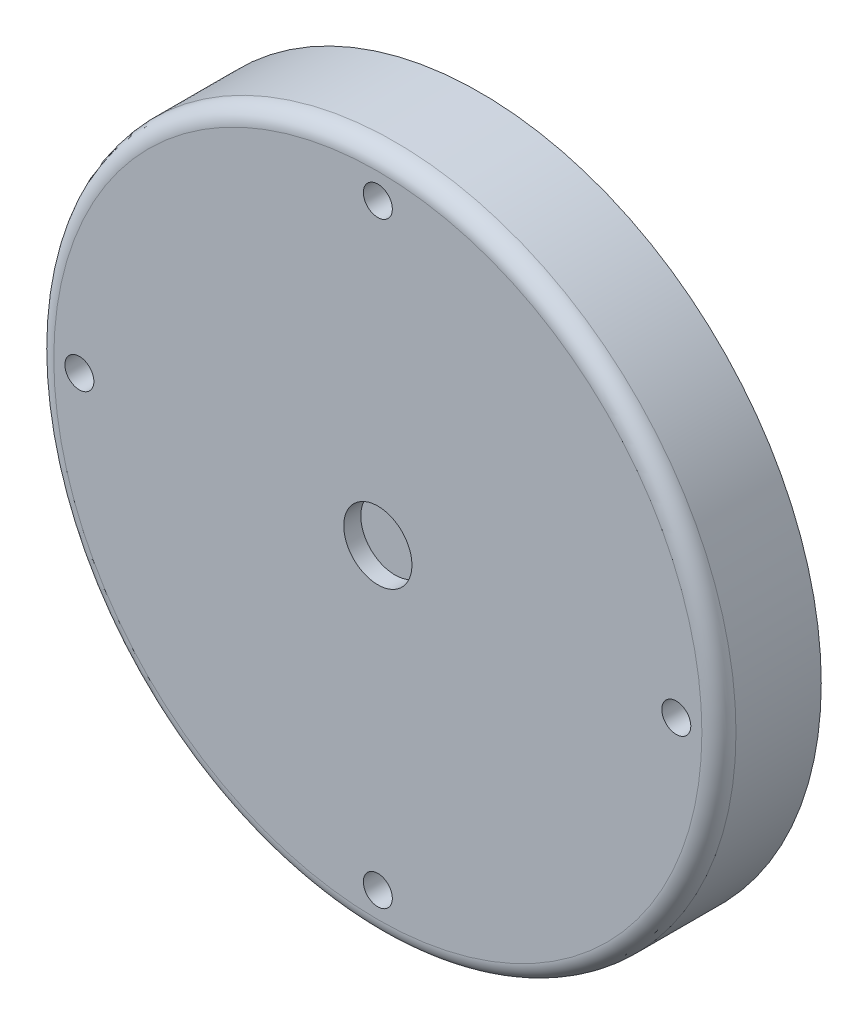
ISO-10303-21;
HEADER;
FILE_DESCRIPTION(('STEP AP214'),'2;1');
FILE_NAME('part.step','',(''),(''),'','','');
FILE_SCHEMA(('AUTOMOTIVE_DESIGN { 1 0 10303 214 1 1 1 1 }'));
ENDSEC;
DATA;
#1=APPLICATION_CONTEXT('core data for automotive mechanical design processes');
#2=APPLICATION_PROTOCOL_DEFINITION('international standard','automotive_design',2000,#1);
#3=PRODUCT_CONTEXT('',#1,'mechanical');
#4=PRODUCT('Part','Part','',(#3));
#5=PRODUCT_RELATED_PRODUCT_CATEGORY('part','',(#4));
#6=PRODUCT_DEFINITION_FORMATION('','',#4);
#7=PRODUCT_DEFINITION_CONTEXT('part definition',#1,'design');
#8=PRODUCT_DEFINITION('design','',#6,#7);
#9=PRODUCT_DEFINITION_SHAPE('','',#8);
#10=(LENGTH_UNIT() NAMED_UNIT(*) SI_UNIT(.MILLI.,.METRE.));
#11=(NAMED_UNIT(*) PLANE_ANGLE_UNIT() SI_UNIT($,.RADIAN.));
#12=(NAMED_UNIT(*) SI_UNIT($,.STERADIAN.) SOLID_ANGLE_UNIT());
#13=UNCERTAINTY_MEASURE_WITH_UNIT(LENGTH_MEASURE(1.E-05),#10,'distance_accuracy_value','');
#14=(GEOMETRIC_REPRESENTATION_CONTEXT(3) GLOBAL_UNCERTAINTY_ASSIGNED_CONTEXT((#13)) GLOBAL_UNIT_ASSIGNED_CONTEXT((#10,
#11,#12)) REPRESENTATION_CONTEXT('',''));
#15=CARTESIAN_POINT('',(0.,0.,0.));
#16=DIRECTION('',(0.,0.,1.));
#17=DIRECTION('',(1.,0.,0.));
#18=AXIS2_PLACEMENT_3D('',#15,#16,#17);
#19=CARTESIAN_POINT('',(0.,0.,-25.));
#20=DIRECTION('',(0.,0.,1.));
#21=DIRECTION('',(1.,0.,0.));
#22=AXIS2_PLACEMENT_3D('',#19,#20,#21);
#23=CYLINDRICAL_SURFACE('',#22,75.);
#24=CARTESIAN_POINT('',(0.,0.,-16.));
#25=DIRECTION('',(0.,0.,1.));
#26=DIRECTION('',(1.,0.,0.));
#27=AXIS2_PLACEMENT_3D('',#24,#25,#26);
#28=CIRCLE('',#27,75.);
#29=CARTESIAN_POINT('',(75.,0.,-16.));
#30=VERTEX_POINT('',#29);
#31=EDGE_CURVE('E108',#30,#30,#28,.T.);
#32=ORIENTED_EDGE('',*,*,#31,.T.);
#33=EDGE_LOOP('',(#32));
#34=FACE_BOUND('',#33,.T.);
#35=CARTESIAN_POINT('',(0.,0.,-25.));
#36=DIRECTION('',(0.,0.,-1.));
#37=DIRECTION('',(-1.,0.,0.));
#38=AXIS2_PLACEMENT_3D('',#35,#36,#37);
#39=CIRCLE('',#38,75.);
#40=CARTESIAN_POINT('',(-75.,0.,-25.));
#41=VERTEX_POINT('',#40);
#42=EDGE_CURVE('E69',#41,#41,#39,.T.);
#43=ORIENTED_EDGE('',*,*,#42,.T.);
#44=EDGE_LOOP('',(#43));
#45=FACE_BOUND('',#44,.T.);
#46=ADVANCED_FACE('F50',(#34,#45),#23,.F.);
#47=CARTESIAN_POINT('',(0.,0.,5.));
#48=DIRECTION('',(0.,0.,-1.));
#49=DIRECTION('',(-1.,0.,0.));
#50=AXIS2_PLACEMENT_3D('',#47,#48,#49);
#51=CYLINDRICAL_SURFACE('',#50,100.);
#52=CARTESIAN_POINT('',(0.,0.,0.));
#53=DIRECTION('',(0.,0.,1.));
#54=DIRECTION('',(1.,0.,0.));
#55=AXIS2_PLACEMENT_3D('',#52,#53,#54);
#56=CIRCLE('',#55,100.);
#57=CARTESIAN_POINT('',(100.,0.,0.));
#58=VERTEX_POINT('',#57);
#59=EDGE_CURVE('E11',#58,#58,#56,.F.);
#60=ORIENTED_EDGE('',*,*,#59,.T.);
#61=EDGE_LOOP('',(#60));
#62=FACE_BOUND('',#61,.T.);
#63=CARTESIAN_POINT('',(0.,0.,-25.));
#64=DIRECTION('',(0.,0.,-1.));
#65=DIRECTION('',(-1.,0.,0.));
#66=AXIS2_PLACEMENT_3D('',#63,#64,#65);
#67=CIRCLE('',#66,100.);
#68=CARTESIAN_POINT('',(-100.,0.,-25.));
#69=VERTEX_POINT('',#68);
#70=EDGE_CURVE('E64',#69,#69,#67,.T.);
#71=ORIENTED_EDGE('',*,*,#70,.F.);
#72=EDGE_LOOP('',(#71));
#73=FACE_BOUND('',#72,.T.);
#74=ADVANCED_FACE('F204',(#62,#73),#51,.T.);
#75=CARTESIAN_POINT('',(0.,0.,5.));
#76=DIRECTION('',(0.,0.,1.));
#77=DIRECTION('',(1.,0.,0.));
#78=AXIS2_PLACEMENT_3D('',#75,#76,#77);
#79=PLANE('',#78);
#80=CARTESIAN_POINT('',(0.,87.5,5.));
#81=DIRECTION('',(0.,0.,1.));
#82=DIRECTION('',(1.,0.,0.));
#83=AXIS2_PLACEMENT_3D('',#80,#81,#82);
#84=CIRCLE('',#83,4.25);
#85=CARTESIAN_POINT('',(4.25,87.5,5.));
#86=VERTEX_POINT('',#85);
#87=EDGE_CURVE('E83',#86,#86,#84,.T.);
#88=ORIENTED_EDGE('',*,*,#87,.F.);
#89=EDGE_LOOP('',(#88));
#90=FACE_BOUND('',#89,.T.);
#91=CARTESIAN_POINT('',(87.5,0.,5.));
#92=DIRECTION('',(0.,0.,1.));
#93=DIRECTION('',(1.,0.,0.));
#94=AXIS2_PLACEMENT_3D('',#91,#92,#93);
#95=CIRCLE('',#94,4.25000000000001);
#96=CARTESIAN_POINT('',(91.75,0.,5.));
#97=VERTEX_POINT('',#96);
#98=EDGE_CURVE('E90',#97,#97,#95,.T.);
#99=ORIENTED_EDGE('',*,*,#98,.F.);
#100=EDGE_LOOP('',(#99));
#101=FACE_BOUND('',#100,.T.);
#102=CARTESIAN_POINT('',(0.,-87.5,5.));
#103=DIRECTION('',(0.,0.,1.));
#104=DIRECTION('',(1.,0.,0.));
#105=AXIS2_PLACEMENT_3D('',#102,#103,#104);
#106=CIRCLE('',#105,4.25);
#107=CARTESIAN_POINT('',(4.25,-87.5,5.));
#108=VERTEX_POINT('',#107);
#109=EDGE_CURVE('E94',#108,#108,#106,.T.);
#110=ORIENTED_EDGE('',*,*,#109,.F.);
#111=EDGE_LOOP('',(#110));
#112=FACE_BOUND('',#111,.T.);
#113=CARTESIAN_POINT('',(-87.5,0.,5.));
#114=DIRECTION('',(0.,0.,1.));
#115=DIRECTION('',(1.,0.,0.));
#116=AXIS2_PLACEMENT_3D('',#113,#114,#115);
#117=CIRCLE('',#116,4.25000000000001);
#118=CARTESIAN_POINT('',(-83.25,0.,5.));
#119=VERTEX_POINT('',#118);
#120=EDGE_CURVE('E98',#119,#119,#117,.T.);
#121=ORIENTED_EDGE('',*,*,#120,.F.);
#122=EDGE_LOOP('',(#121));
#123=FACE_BOUND('',#122,.T.);
#124=CARTESIAN_POINT('',(0.,0.,5.));
#125=DIRECTION('',(0.,0.,1.));
#126=DIRECTION('',(1.,0.,0.));
#127=AXIS2_PLACEMENT_3D('',#124,#125,#126);
#128=CIRCLE('',#127,10.);
#129=CARTESIAN_POINT('',(10.,0.,5.));
#130=VERTEX_POINT('',#129);
#131=EDGE_CURVE('E79',#130,#130,#128,.T.);
#132=ORIENTED_EDGE('',*,*,#131,.F.);
#133=EDGE_LOOP('',(#132));
#134=FACE_BOUND('',#133,.T.);
#135=CARTESIAN_POINT('',(0.,0.,5.));
#136=DIRECTION('',(0.,0.,1.));
#137=DIRECTION('',(1.,0.,0.));
#138=AXIS2_PLACEMENT_3D('',#135,#136,#137);
#139=CIRCLE('',#138,95.);
#140=CARTESIAN_POINT('',(95.,0.,5.));
#141=VERTEX_POINT('',#140);
#142=EDGE_CURVE('E58',#141,#141,#139,.T.);
#143=ORIENTED_EDGE('',*,*,#142,.T.);
#144=EDGE_LOOP('',(#143));
#145=FACE_BOUND('',#144,.T.);
#146=ADVANCED_FACE('F209',(#90,#101,#112,#123,#134,#145),#79,.T.);
#147=CARTESIAN_POINT('',(0.,0.,-25.));
#148=DIRECTION('',(0.,0.,-1.));
#149=DIRECTION('',(-1.,0.,0.));
#150=AXIS2_PLACEMENT_3D('',#147,#148,#149);
#151=PLANE('',#150);
#152=CARTESIAN_POINT('',(0.,87.5,-25.));
#153=DIRECTION('',(0.,0.,1.));
#154=DIRECTION('',(1.,0.,0.));
#155=AXIS2_PLACEMENT_3D('',#152,#153,#154);
#156=CIRCLE('',#155,4.25);
#157=CARTESIAN_POINT('',(4.25,87.5,-25.));
#158=VERTEX_POINT('',#157);
#159=EDGE_CURVE('E102',#158,#158,#156,.T.);
#160=ORIENTED_EDGE('',*,*,#159,.T.);
#161=EDGE_LOOP('',(#160));
#162=FACE_BOUND('',#161,.T.);
#163=CARTESIAN_POINT('',(87.5,0.,-25.));
#164=DIRECTION('',(0.,0.,1.));
#165=DIRECTION('',(1.,0.,0.));
#166=AXIS2_PLACEMENT_3D('',#163,#164,#165);
#167=CIRCLE('',#166,4.25000000000001);
#168=CARTESIAN_POINT('',(91.75,0.,-25.));
#169=VERTEX_POINT('',#168);
#170=EDGE_CURVE('E112',#169,#169,#167,.T.);
#171=ORIENTED_EDGE('',*,*,#170,.T.);
#172=EDGE_LOOP('',(#171));
#173=FACE_BOUND('',#172,.T.);
#174=CARTESIAN_POINT('',(0.,-87.5,-25.));
#175=DIRECTION('',(0.,0.,1.));
#176=DIRECTION('',(1.,0.,0.));
#177=AXIS2_PLACEMENT_3D('',#174,#175,#176);
#178=CIRCLE('',#177,4.25);
#179=CARTESIAN_POINT('',(4.25,-87.5,-25.));
#180=VERTEX_POINT('',#179);
#181=EDGE_CURVE('E107',#180,#180,#178,.T.);
#182=ORIENTED_EDGE('',*,*,#181,.T.);
#183=EDGE_LOOP('',(#182));
#184=FACE_BOUND('',#183,.T.);
#185=CARTESIAN_POINT('',(-87.5,0.,-25.));
#186=DIRECTION('',(0.,0.,1.));
#187=DIRECTION('',(1.,0.,0.));
#188=AXIS2_PLACEMENT_3D('',#185,#186,#187);
#189=CIRCLE('',#188,4.25000000000001);
#190=CARTESIAN_POINT('',(-83.25,0.,-25.));
#191=VERTEX_POINT('',#190);
#192=EDGE_CURVE('E103',#191,#191,#189,.T.);
#193=ORIENTED_EDGE('',*,*,#192,.T.);
#194=EDGE_LOOP('',(#193));
#195=FACE_BOUND('',#194,.T.);
#196=ORIENTED_EDGE('',*,*,#70,.T.);
#197=EDGE_LOOP('',(#196));
#198=FACE_BOUND('',#197,.T.);
#199=ORIENTED_EDGE('',*,*,#42,.F.);
#200=EDGE_LOOP('',(#199));
#201=FACE_BOUND('',#200,.T.);
#202=ADVANCED_FACE('F214',(#162,#173,#184,#195,#198,#201),#151,.T.);
#203=CARTESIAN_POINT('',(0.,0.,0.));
#204=DIRECTION('',(0.,0.,1.));
#205=DIRECTION('',(1.,0.,0.));
#206=AXIS2_PLACEMENT_3D('',#203,#204,#205);
#207=TOROIDAL_SURFACE('',#206,95.,5.);
#208=ORIENTED_EDGE('',*,*,#59,.F.);
#209=EDGE_LOOP('',(#208));
#210=FACE_BOUND('',#209,.T.);
#211=ORIENTED_EDGE('',*,*,#142,.F.);
#212=EDGE_LOOP('',(#211));
#213=FACE_BOUND('',#212,.T.);
#214=ADVANCED_FACE('F52',(#210,#213),#207,.T.);
#215=CARTESIAN_POINT('',(0.,0.,0.));
#216=DIRECTION('',(0.,0.,1.));
#217=DIRECTION('',(1.,0.,0.));
#218=AXIS2_PLACEMENT_3D('',#215,#216,#217);
#219=CYLINDRICAL_SURFACE('',#218,10.);
#220=CARTESIAN_POINT('',(0.,0.,0.));
#221=DIRECTION('',(0.,0.,1.));
#222=DIRECTION('',(1.,0.,0.));
#223=AXIS2_PLACEMENT_3D('',#220,#221,#222);
#224=CIRCLE('',#223,10.);
#225=CARTESIAN_POINT('',(10.,0.,0.));
#226=VERTEX_POINT('',#225);
#227=EDGE_CURVE('E75',#226,#226,#224,.T.);
#228=ORIENTED_EDGE('',*,*,#227,.F.);
#229=EDGE_LOOP('',(#228));
#230=FACE_BOUND('',#229,.T.);
#231=ORIENTED_EDGE('',*,*,#131,.T.);
#232=EDGE_LOOP('',(#231));
#233=FACE_BOUND('',#232,.T.);
#234=ADVANCED_FACE('F221',(#230,#233),#219,.F.);
#235=CARTESIAN_POINT('',(0.,0.,0.));
#236=DIRECTION('',(0.,0.,1.));
#237=DIRECTION('',(1.,0.,0.));
#238=AXIS2_PLACEMENT_3D('',#235,#236,#237);
#239=PLANE('',#238);
#240=ORIENTED_EDGE('',*,*,#227,.T.);
#241=EDGE_LOOP('',(#240));
#242=FACE_BOUND('',#241,.T.);
#243=ADVANCED_FACE('F239',(#242),#239,.T.);
#244=CARTESIAN_POINT('',(-87.5,0.,-25.));
#245=DIRECTION('',(0.,0.,1.));
#246=DIRECTION('',(1.,0.,0.));
#247=AXIS2_PLACEMENT_3D('',#244,#245,#246);
#248=CYLINDRICAL_SURFACE('',#247,4.25000000000001);
#249=ORIENTED_EDGE('',*,*,#120,.T.);
#250=EDGE_LOOP('',(#249));
#251=FACE_BOUND('',#250,.T.);
#252=ORIENTED_EDGE('',*,*,#192,.F.);
#253=EDGE_LOOP('',(#252));
#254=FACE_BOUND('',#253,.T.);
#255=ADVANCED_FACE('F236',(#251,#254),#248,.F.);
#256=CARTESIAN_POINT('',(0.,-87.5,-25.));
#257=DIRECTION('',(0.,0.,1.));
#258=DIRECTION('',(1.,0.,0.));
#259=AXIS2_PLACEMENT_3D('',#256,#257,#258);
#260=CYLINDRICAL_SURFACE('',#259,4.25);
#261=ORIENTED_EDGE('',*,*,#109,.T.);
#262=EDGE_LOOP('',(#261));
#263=FACE_BOUND('',#262,.T.);
#264=ORIENTED_EDGE('',*,*,#181,.F.);
#265=EDGE_LOOP('',(#264));
#266=FACE_BOUND('',#265,.T.);
#267=ADVANCED_FACE('F238',(#263,#266),#260,.F.);
#268=CARTESIAN_POINT('',(87.5,0.,-25.));
#269=DIRECTION('',(0.,0.,1.));
#270=DIRECTION('',(1.,0.,0.));
#271=AXIS2_PLACEMENT_3D('',#268,#269,#270);
#272=CYLINDRICAL_SURFACE('',#271,4.25000000000001);
#273=ORIENTED_EDGE('',*,*,#98,.T.);
#274=EDGE_LOOP('',(#273));
#275=FACE_BOUND('',#274,.T.);
#276=ORIENTED_EDGE('',*,*,#170,.F.);
#277=EDGE_LOOP('',(#276));
#278=FACE_BOUND('',#277,.T.);
#279=ADVANCED_FACE('F246',(#275,#278),#272,.F.);
#280=CARTESIAN_POINT('',(0.,87.5,-25.));
#281=DIRECTION('',(0.,0.,1.));
#282=DIRECTION('',(1.,0.,0.));
#283=AXIS2_PLACEMENT_3D('',#280,#281,#282);
#284=CYLINDRICAL_SURFACE('',#283,4.25);
#285=ORIENTED_EDGE('',*,*,#87,.T.);
#286=EDGE_LOOP('',(#285));
#287=FACE_BOUND('',#286,.T.);
#288=ORIENTED_EDGE('',*,*,#159,.F.);
#289=EDGE_LOOP('',(#288));
#290=FACE_BOUND('',#289,.T.);
#291=ADVANCED_FACE('F305',(#287,#290),#284,.F.);
#292=CARTESIAN_POINT('',(0.,0.,-16.));
#293=DIRECTION('',(0.,0.,-1.));
#294=DIRECTION('',(-1.,0.,0.));
#295=AXIS2_PLACEMENT_3D('',#292,#293,#294);
#296=PLANE('',#295);
#297=ORIENTED_EDGE('',*,*,#31,.F.);
#298=EDGE_LOOP('',(#297));
#299=FACE_BOUND('',#298,.T.);
#300=CARTESIAN_POINT('',(0.,0.,-16.));
#301=DIRECTION('',(0.,0.,1.));
#302=DIRECTION('',(1.,0.,0.));
#303=AXIS2_PLACEMENT_3D('',#300,#301,#302);
#304=CIRCLE('',#303,81.);
#305=CARTESIAN_POINT('',(81.,0.,-16.));
#306=VERTEX_POINT('',#305);
#307=EDGE_CURVE('E122',#306,#306,#304,.T.);
#308=ORIENTED_EDGE('',*,*,#307,.T.);
#309=EDGE_LOOP('',(#308));
#310=FACE_BOUND('',#309,.T.);
#311=ADVANCED_FACE('F314',(#299,#310),#296,.F.);
#312=CARTESIAN_POINT('',(0.,0.,17.3698436175611));
#313=DIRECTION('',(0.,0.,1.));
#314=DIRECTION('',(1.,0.,0.));
#315=AXIS2_PLACEMENT_3D('',#312,#313,#314);
#316=CYLINDRICAL_SURFACE('',#315,81.);
#317=ORIENTED_EDGE('',*,*,#307,.F.);
#318=EDGE_LOOP('',(#317));
#319=FACE_BOUND('',#318,.T.);
#320=CARTESIAN_POINT('',(0.,0.,-9.99999999999998));
#321=DIRECTION('',(0.,0.,1.));
#322=DIRECTION('',(1.,0.,0.));
#323=AXIS2_PLACEMENT_3D('',#320,#321,#322);
#324=CIRCLE('',#323,81.);
#325=CARTESIAN_POINT('',(81.,0.,-9.99999999999998));
#326=VERTEX_POINT('',#325);
#327=EDGE_CURVE('E126',#326,#326,#324,.T.);
#328=ORIENTED_EDGE('',*,*,#327,.T.);
#329=EDGE_LOOP('',(#328));
#330=FACE_BOUND('',#329,.T.);
#331=ADVANCED_FACE('F331',(#319,#330),#316,.F.);
#332=CARTESIAN_POINT('',(0.,0.,-9.99999999999998));
#333=DIRECTION('',(0.,0.,1.));
#334=DIRECTION('',(1.,0.,0.));
#335=AXIS2_PLACEMENT_3D('',#332,#333,#334);
#336=PLANE('',#335);
#337=ORIENTED_EDGE('',*,*,#327,.F.);
#338=EDGE_LOOP('',(#337));
#339=FACE_BOUND('',#338,.T.);
#340=CARTESIAN_POINT('',(0.,0.,-9.99999999999998));
#341=DIRECTION('',(0.,0.,1.));
#342=DIRECTION('',(1.,0.,0.));
#343=AXIS2_PLACEMENT_3D('',#340,#341,#342);
#344=CIRCLE('',#343,75.);
#345=CARTESIAN_POINT('',(75.,0.,-9.99999999999998));
#346=VERTEX_POINT('',#345);
#347=EDGE_CURVE('E130',#346,#346,#344,.T.);
#348=ORIENTED_EDGE('',*,*,#347,.T.);
#349=EDGE_LOOP('',(#348));
#350=FACE_BOUND('',#349,.T.);
#351=ADVANCED_FACE('F180',(#339,#350),#336,.F.);
#352=CARTESIAN_POINT('',(0.,0.,-5.));
#353=DIRECTION('',(0.,0.,1.));
#354=DIRECTION('',(1.,0.,0.));
#355=AXIS2_PLACEMENT_3D('',#352,#353,#354);
#356=PLANE('',#355);
#357=CARTESIAN_POINT('',(0.,-64.,-5.));
#358=DIRECTION('',(0.,0.,-1.));
#359=DIRECTION('',(-1.,0.,0.));
#360=AXIS2_PLACEMENT_3D('',#357,#358,#359);
#361=CIRCLE('',#360,0.600000000000001);
#362=CARTESIAN_POINT('',(-0.600000000000001,-64.,-5.));
#363=VERTEX_POINT('',#362);
#364=EDGE_CURVE('E159',#363,#363,#361,.T.);
#365=ORIENTED_EDGE('',*,*,#364,.F.);
#366=EDGE_LOOP('',(#365));
#367=FACE_BOUND('',#366,.T.);
#368=CARTESIAN_POINT('',(64.,0.,-5.));
#369=DIRECTION('',(0.,0.,-1.));
#370=DIRECTION('',(-1.,0.,0.));
#371=AXIS2_PLACEMENT_3D('',#368,#369,#370);
#372=CIRCLE('',#371,0.600000000000007);
#373=CARTESIAN_POINT('',(63.4,0.,-5.));
#374=VERTEX_POINT('',#373);
#375=EDGE_CURVE('E155',#374,#374,#372,.T.);
#376=ORIENTED_EDGE('',*,*,#375,.F.);
#377=EDGE_LOOP('',(#376));
#378=FACE_BOUND('',#377,.T.);
#379=CARTESIAN_POINT('',(0.,64.,-5.));
#380=DIRECTION('',(0.,0.,-1.));
#381=DIRECTION('',(-1.,0.,0.));
#382=AXIS2_PLACEMENT_3D('',#379,#380,#381);
#383=CIRCLE('',#382,0.600000000000001);
#384=CARTESIAN_POINT('',(-0.600000000000001,64.,-5.));
#385=VERTEX_POINT('',#384);
#386=EDGE_CURVE('E147',#385,#385,#383,.T.);
#387=ORIENTED_EDGE('',*,*,#386,.F.);
#388=EDGE_LOOP('',(#387));
#389=FACE_BOUND('',#388,.T.);
#390=CARTESIAN_POINT('',(-64.,0.,-5.));
#391=DIRECTION('',(0.,0.,-1.));
#392=DIRECTION('',(-1.,0.,0.));
#393=AXIS2_PLACEMENT_3D('',#390,#391,#392);
#394=CIRCLE('',#393,0.600000000000007);
#395=CARTESIAN_POINT('',(-64.6,0.,-5.));
#396=VERTEX_POINT('',#395);
#397=EDGE_CURVE('E139',#396,#396,#394,.T.);
#398=ORIENTED_EDGE('',*,*,#397,.F.);
#399=EDGE_LOOP('',(#398));
#400=FACE_BOUND('',#399,.T.);
#401=CARTESIAN_POINT('',(0.,0.,-5.));
#402=DIRECTION('',(0.,0.,-1.));
#403=DIRECTION('',(-1.,0.,0.));
#404=AXIS2_PLACEMENT_3D('',#401,#402,#403);
#405=CIRCLE('',#404,75.);
#406=CARTESIAN_POINT('',(-75.,0.,-5.));
#407=VERTEX_POINT('',#406);
#408=EDGE_CURVE('E72',#407,#407,#405,.T.);
#409=ORIENTED_EDGE('',*,*,#408,.T.);
#410=EDGE_LOOP('',(#409));
#411=FACE_BOUND('',#410,.T.);
#412=ADVANCED_FACE('F176',(#367,#378,#389,#400,#411),#356,.F.);
#413=ORIENTED_EDGE('',*,*,#347,.F.);
#414=EDGE_LOOP('',(#413));
#415=FACE_BOUND('',#414,.T.);
#416=ORIENTED_EDGE('',*,*,#408,.F.);
#417=EDGE_LOOP('',(#416));
#418=FACE_BOUND('',#417,.T.);
#419=ADVANCED_FACE('F179',(#415,#418),#23,.F.);
#420=CARTESIAN_POINT('',(-64.,0.,-2.));
#421=DIRECTION('',(0.,0.,-1.));
#422=DIRECTION('',(-1.,0.,0.));
#423=AXIS2_PLACEMENT_3D('',#420,#421,#422);
#424=CYLINDRICAL_SURFACE('',#423,0.600000000000007);
#425=CARTESIAN_POINT('',(-64.,0.,-2.));
#426=DIRECTION('',(0.,0.,-1.));
#427=DIRECTION('',(-1.,0.,0.));
#428=AXIS2_PLACEMENT_3D('',#425,#426,#427);
#429=CIRCLE('',#428,0.600000000000007);
#430=CARTESIAN_POINT('',(-64.6,0.,-2.));
#431=VERTEX_POINT('',#430);
#432=EDGE_CURVE('E135',#431,#431,#429,.T.);
#433=ORIENTED_EDGE('',*,*,#432,.F.);
#434=EDGE_LOOP('',(#433));
#435=FACE_BOUND('',#434,.T.);
#436=ORIENTED_EDGE('',*,*,#397,.T.);
#437=EDGE_LOOP('',(#436));
#438=FACE_BOUND('',#437,.T.);
#439=ADVANCED_FACE('F191',(#435,#438),#424,.F.);
#440=CARTESIAN_POINT('',(-64.,0.,-2.));
#441=DIRECTION('',(0.,0.,-1.));
#442=DIRECTION('',(-1.,0.,0.));
#443=AXIS2_PLACEMENT_3D('',#440,#441,#442);
#444=PLANE('',#443);
#445=ORIENTED_EDGE('',*,*,#432,.T.);
#446=EDGE_LOOP('',(#445));
#447=FACE_BOUND('',#446,.T.);
#448=ADVANCED_FACE('F197',(#447),#444,.T.);
#449=CARTESIAN_POINT('',(0.,64.,-2.));
#450=DIRECTION('',(0.,0.,-1.));
#451=DIRECTION('',(-1.,0.,0.));
#452=AXIS2_PLACEMENT_3D('',#449,#450,#451);
#453=CYLINDRICAL_SURFACE('',#452,0.600000000000001);
#454=CARTESIAN_POINT('',(0.,64.,-2.));
#455=DIRECTION('',(0.,0.,-1.));
#456=DIRECTION('',(-1.,0.,0.));
#457=AXIS2_PLACEMENT_3D('',#454,#455,#456);
#458=CIRCLE('',#457,0.600000000000001);
#459=CARTESIAN_POINT('',(-0.600000000000001,64.,-2.));
#460=VERTEX_POINT('',#459);
#461=EDGE_CURVE('E143',#460,#460,#458,.T.);
#462=ORIENTED_EDGE('',*,*,#461,.F.);
#463=EDGE_LOOP('',(#462));
#464=FACE_BOUND('',#463,.T.);
#465=ORIENTED_EDGE('',*,*,#386,.T.);
#466=EDGE_LOOP('',(#465));
#467=FACE_BOUND('',#466,.T.);
#468=ADVANCED_FACE('F377',(#464,#467),#453,.F.);
#469=CARTESIAN_POINT('',(0.,64.,-2.));
#470=DIRECTION('',(0.,0.,-1.));
#471=DIRECTION('',(-1.,0.,0.));
#472=AXIS2_PLACEMENT_3D('',#469,#470,#471);
#473=PLANE('',#472);
#474=ORIENTED_EDGE('',*,*,#461,.T.);
#475=EDGE_LOOP('',(#474));
#476=FACE_BOUND('',#475,.T.);
#477=ADVANCED_FACE('F388',(#476),#473,.T.);
#478=CARTESIAN_POINT('',(64.,0.,-2.));
#479=DIRECTION('',(0.,0.,-1.));
#480=DIRECTION('',(-1.,0.,0.));
#481=AXIS2_PLACEMENT_3D('',#478,#479,#480);
#482=CYLINDRICAL_SURFACE('',#481,0.600000000000007);
#483=CARTESIAN_POINT('',(64.,0.,-2.));
#484=DIRECTION('',(0.,0.,-1.));
#485=DIRECTION('',(-1.,0.,0.));
#486=AXIS2_PLACEMENT_3D('',#483,#484,#485);
#487=CIRCLE('',#486,0.600000000000007);
#488=CARTESIAN_POINT('',(63.4,0.,-2.));
#489=VERTEX_POINT('',#488);
#490=EDGE_CURVE('E151',#489,#489,#487,.T.);
#491=ORIENTED_EDGE('',*,*,#490,.F.);
#492=EDGE_LOOP('',(#491));
#493=FACE_BOUND('',#492,.T.);
#494=ORIENTED_EDGE('',*,*,#375,.T.);
#495=EDGE_LOOP('',(#494));
#496=FACE_BOUND('',#495,.T.);
#497=ADVANCED_FACE('F399',(#493,#496),#482,.F.);
#498=CARTESIAN_POINT('',(64.,0.,-2.));
#499=DIRECTION('',(0.,0.,-1.));
#500=DIRECTION('',(-1.,0.,0.));
#501=AXIS2_PLACEMENT_3D('',#498,#499,#500);
#502=PLANE('',#501);
#503=ORIENTED_EDGE('',*,*,#490,.T.);
#504=EDGE_LOOP('',(#503));
#505=FACE_BOUND('',#504,.T.);
#506=ADVANCED_FACE('F172',(#505),#502,.T.);
#507=CARTESIAN_POINT('',(0.,-64.,-2.));
#508=DIRECTION('',(0.,0.,-1.));
#509=DIRECTION('',(-1.,0.,0.));
#510=AXIS2_PLACEMENT_3D('',#507,#508,#509);
#511=CYLINDRICAL_SURFACE('',#510,0.600000000000001);
#512=CARTESIAN_POINT('',(0.,-64.,-2.));
#513=DIRECTION('',(0.,0.,-1.));
#514=DIRECTION('',(-1.,0.,0.));
#515=AXIS2_PLACEMENT_3D('',#512,#513,#514);
#516=CIRCLE('',#515,0.600000000000001);
#517=CARTESIAN_POINT('',(-0.600000000000001,-64.,-2.));
#518=VERTEX_POINT('',#517);
#519=EDGE_CURVE('E134',#518,#518,#516,.T.);
#520=ORIENTED_EDGE('',*,*,#519,.F.);
#521=EDGE_LOOP('',(#520));
#522=FACE_BOUND('',#521,.T.);
#523=ORIENTED_EDGE('',*,*,#364,.T.);
#524=EDGE_LOOP('',(#523));
#525=FACE_BOUND('',#524,.T.);
#526=ADVANCED_FACE('F169',(#522,#525),#511,.F.);
#527=CARTESIAN_POINT('',(0.,-64.,-2.));
#528=DIRECTION('',(0.,0.,-1.));
#529=DIRECTION('',(-1.,0.,0.));
#530=AXIS2_PLACEMENT_3D('',#527,#528,#529);
#531=PLANE('',#530);
#532=ORIENTED_EDGE('',*,*,#519,.T.);
#533=EDGE_LOOP('',(#532));
#534=FACE_BOUND('',#533,.T.);
#535=ADVANCED_FACE('F167',(#534),#531,.T.);
#536=CLOSED_SHELL('',(#46,#74,#146,#202,#214,#234,#243,#255,#267,#279,#291,#311,#331,#351,#412,
#419,#439,#448,#468,#477,#497,#506,#526,#535));
#537=MANIFOLD_SOLID_BREP('B2',#536);
#538=ADVANCED_BREP_SHAPE_REPRESENTATION('',(#18,#537),#14);
#539=SHAPE_DEFINITION_REPRESENTATION(#9,#538);
ENDSEC;
END-ISO-10303-21;
